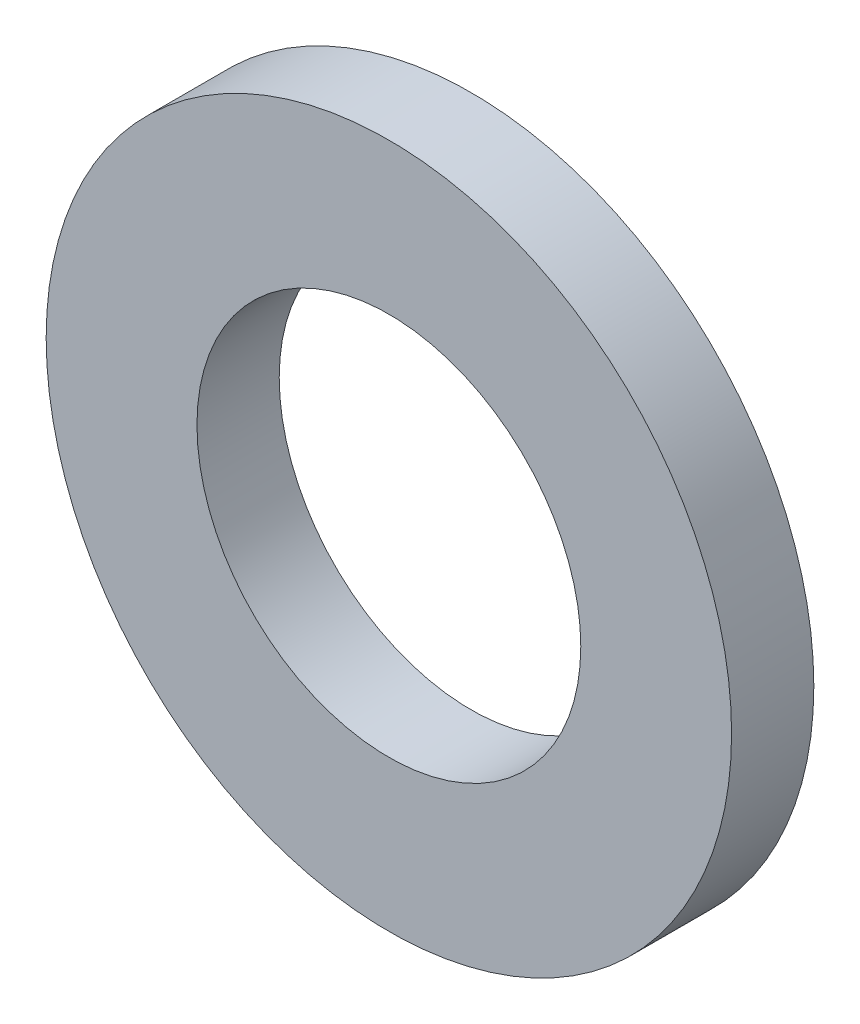
ISO-10303-21;
HEADER;
FILE_DESCRIPTION(('STEP AP214'),'2;1');
FILE_NAME('part.step','',(''),(''),'','','');
FILE_SCHEMA(('AUTOMOTIVE_DESIGN { 1 0 10303 214 1 1 1 1 }'));
ENDSEC;
DATA;
#1=APPLICATION_CONTEXT('core data for automotive mechanical design processes');
#2=APPLICATION_PROTOCOL_DEFINITION('international standard','automotive_design',2000,#1);
#3=PRODUCT_CONTEXT('',#1,'mechanical');
#4=PRODUCT('Part','Part','',(#3));
#5=PRODUCT_RELATED_PRODUCT_CATEGORY('part','',(#4));
#6=PRODUCT_DEFINITION_FORMATION('','',#4);
#7=PRODUCT_DEFINITION_CONTEXT('part definition',#1,'design');
#8=PRODUCT_DEFINITION('design','',#6,#7);
#9=PRODUCT_DEFINITION_SHAPE('','',#8);
#10=(LENGTH_UNIT() NAMED_UNIT(*) SI_UNIT(.MILLI.,.METRE.));
#11=(NAMED_UNIT(*) PLANE_ANGLE_UNIT() SI_UNIT($,.RADIAN.));
#12=(NAMED_UNIT(*) SI_UNIT($,.STERADIAN.) SOLID_ANGLE_UNIT());
#13=UNCERTAINTY_MEASURE_WITH_UNIT(LENGTH_MEASURE(1.E-05),#10,'distance_accuracy_value','');
#14=(GEOMETRIC_REPRESENTATION_CONTEXT(3) GLOBAL_UNCERTAINTY_ASSIGNED_CONTEXT((#13)) GLOBAL_UNIT_ASSIGNED_CONTEXT((#10,
#11,#12)) REPRESENTATION_CONTEXT('',''));
#15=CARTESIAN_POINT('',(0.,0.,0.));
#16=DIRECTION('',(0.,0.,1.));
#17=DIRECTION('',(1.,0.,0.));
#18=AXIS2_PLACEMENT_3D('',#15,#16,#17);
#19=CARTESIAN_POINT('',(-1.11022302462516E-13,-5.55111512312578E-13,1.7999999999998));
#20=DIRECTION('',(0.,0.,0.999999999999985));
#21=DIRECTION('',(1.00000000000007,0.,0.));
#22=AXIS2_PLACEMENT_3D('',#19,#20,#21);
#23=PLANE('',#22);
#24=CARTESIAN_POINT('',(-1.11022302462516E-13,-5.55111512312578E-13,1.7999999999998));
#25=DIRECTION('',(0.,0.,0.999999999999985));
#26=DIRECTION('',(1.00000000000007,0.,0.));
#27=AXIS2_PLACEMENT_3D('',#24,#25,#26);
#28=CIRCLE('',#27,7.5);
#29=CARTESIAN_POINT('',(-7.50000000000064,-5.46576672810772E-13,1.79999999999976));
#30=VERTEX_POINT('',#29);
#31=EDGE_CURVE('E12',#30,#30,#28,.T.);
#32=ORIENTED_EDGE('',*,*,#31,.T.);
#33=EDGE_LOOP('',(#32));
#34=FACE_BOUND('',#33,.T.);
#35=CARTESIAN_POINT('',(-1.11022302462516E-13,-5.55111512312578E-13,1.7999999999998));
#36=DIRECTION('',(0.,0.,0.999999999999985));
#37=DIRECTION('',(1.00000000000007,0.,0.));
#38=AXIS2_PLACEMENT_3D('',#35,#36,#37);
#39=CIRCLE('',#38,4.2);
#40=CARTESIAN_POINT('',(-4.20000000000041,-5.50332002191567E-13,1.79999999999978));
#41=VERTEX_POINT('',#40);
#42=EDGE_CURVE('E49',#41,#41,#39,.T.);
#43=ORIENTED_EDGE('',*,*,#42,.F.);
#44=EDGE_LOOP('',(#43));
#45=FACE_BOUND('',#44,.T.);
#46=ADVANCED_FACE('F38',(#34,#45),#23,.T.);
#47=CARTESIAN_POINT('',(0.,0.,0.));
#48=DIRECTION('',(0.,0.,0.999999999999985));
#49=DIRECTION('',(1.00000000000007,0.,0.));
#50=AXIS2_PLACEMENT_3D('',#47,#48,#49);
#51=PLANE('',#50);
#52=CARTESIAN_POINT('',(0.,0.,0.));
#53=DIRECTION('',(0.,0.,0.999999999999985));
#54=DIRECTION('',(1.00000000000007,0.,0.));
#55=AXIS2_PLACEMENT_3D('',#52,#53,#54);
#56=CIRCLE('',#55,7.5);
#57=CARTESIAN_POINT('',(-7.50000000000063,-5.35085864505903E-13,0.));
#58=VERTEX_POINT('',#57);
#59=EDGE_CURVE('E42',#58,#58,#56,.T.);
#60=ORIENTED_EDGE('',*,*,#59,.F.);
#61=EDGE_LOOP('',(#60));
#62=FACE_BOUND('',#61,.T.);
#63=CARTESIAN_POINT('',(0.,0.,0.));
#64=DIRECTION('',(0.,0.,0.999999999999985));
#65=DIRECTION('',(1.00000000000007,0.,0.));
#66=AXIS2_PLACEMENT_3D('',#63,#64,#65);
#67=CIRCLE('',#66,4.2);
#68=CARTESIAN_POINT('',(-4.2000000000004,-5.38841193886697E-13,0.));
#69=VERTEX_POINT('',#68);
#70=EDGE_CURVE('E51',#69,#69,#67,.T.);
#71=ORIENTED_EDGE('',*,*,#70,.T.);
#72=EDGE_LOOP('',(#71));
#73=FACE_BOUND('',#72,.T.);
#74=ADVANCED_FACE('F61',(#62,#73),#51,.F.);
#75=CARTESIAN_POINT('',(-1.11022302462516E-13,-5.55111512312578E-13,1.7999999999998));
#76=DIRECTION('',(0.,0.,-0.999999999999985));
#77=DIRECTION('',(-1.00000000000007,0.,0.));
#78=AXIS2_PLACEMENT_3D('',#75,#76,#77);
#79=CYLINDRICAL_SURFACE('',#78,7.5);
#80=CARTESIAN_POINT('',(-7.50000000000064,-5.46576672810772E-13,1.79999999999976));
#81=CARTESIAN_POINT('',(-7.50000000000064,-5.46456976890929E-13,1.78124999999976));
#82=CARTESIAN_POINT('',(-7.50000000000064,-5.46337280971087E-13,1.76249999999976));
#83=CARTESIAN_POINT('',(-7.50000000000064,-5.46097889131402E-13,1.72499999999977));
#84=CARTESIAN_POINT('',(-7.50000000000064,-5.4597819321156E-13,1.70624999999977));
#85=CARTESIAN_POINT('',(-7.50000000000064,-5.45738801371875E-13,1.66874999999977));
#86=CARTESIAN_POINT('',(-7.50000000000064,-5.45619105452033E-13,1.64999999999977));
#87=CARTESIAN_POINT('',(-7.50000000000064,-5.45379713612348E-13,1.61249999999978));
#88=CARTESIAN_POINT('',(-7.50000000000064,-5.45260017692505E-13,1.59374999999978));
#89=CARTESIAN_POINT('',(-7.50000000000064,-5.45020625852821E-13,1.55624999999978));
#90=CARTESIAN_POINT('',(-7.50000000000064,-5.44900929932978E-13,1.53749999999979));
#91=CARTESIAN_POINT('',(-7.50000000000064,-5.44661538093294E-13,1.49999999999979));
#92=CARTESIAN_POINT('',(-7.50000000000064,-5.44541842173451E-13,1.48124999999979));
#93=CARTESIAN_POINT('',(-7.50000000000064,-5.44302450333766E-13,1.4437499999998));
#94=CARTESIAN_POINT('',(-7.50000000000064,-5.44182754413924E-13,1.4249999999998));
#95=CARTESIAN_POINT('',(-7.50000000000064,-5.43943362574239E-13,1.3874999999998));
#96=CARTESIAN_POINT('',(-7.50000000000064,-5.43823666654397E-13,1.36874999999981));
#97=CARTESIAN_POINT('',(-7.50000000000064,-5.43584274814712E-13,1.33124999999981));
#98=CARTESIAN_POINT('',(-7.50000000000064,-5.4346457889487E-13,1.31249999999981));
#99=CARTESIAN_POINT('',(-7.50000000000064,-5.43225187055185E-13,1.27499999999982));
#100=CARTESIAN_POINT('',(-7.50000000000064,-5.43105491135343E-13,1.25624999999982));
#101=CARTESIAN_POINT('',(-7.50000000000064,-5.42866099295658E-13,1.21874999999982));
#102=CARTESIAN_POINT('',(-7.50000000000064,-5.42746403375815E-13,1.19999999999982));
#103=CARTESIAN_POINT('',(-7.50000000000064,-5.42507011536131E-13,1.16249999999983));
#104=CARTESIAN_POINT('',(-7.50000000000064,-5.42387315616288E-13,1.14374999999983));
#105=CARTESIAN_POINT('',(-7.50000000000064,-5.42147923776603E-13,1.10624999999983));
#106=CARTESIAN_POINT('',(-7.50000000000064,-5.42028227856761E-13,1.08749999999984));
#107=CARTESIAN_POINT('',(-7.50000000000064,-5.41788836017076E-13,1.04999999999984));
#108=CARTESIAN_POINT('',(-7.50000000000064,-5.41669140097234E-13,1.03124999999984));
#109=CARTESIAN_POINT('',(-7.50000000000064,-5.41429748257549E-13,0.993749999999847));
#110=CARTESIAN_POINT('',(-7.50000000000063,-5.41310052337707E-13,0.974999999999849));
#111=CARTESIAN_POINT('',(-7.50000000000063,-5.41070660498022E-13,0.937499999999853));
#112=CARTESIAN_POINT('',(-7.50000000000063,-5.4095096457818E-13,0.918749999999855));
#113=CARTESIAN_POINT('',(-7.50000000000063,-5.40711572738495E-13,0.881249999999859));
#114=CARTESIAN_POINT('',(-7.50000000000063,-5.40591876818652E-13,0.862499999999861));
#115=CARTESIAN_POINT('',(-7.50000000000063,-5.40352484978968E-13,0.824999999999865));
#116=CARTESIAN_POINT('',(-7.50000000000063,-5.40232789059125E-13,0.806249999999867));
#117=CARTESIAN_POINT('',(-7.50000000000063,-5.3999339721944E-13,0.768749999999871));
#118=CARTESIAN_POINT('',(-7.50000000000063,-5.39873701299598E-13,0.749999999999874));
#119=CARTESIAN_POINT('',(-7.50000000000063,-5.39634309459913E-13,0.712499999999878));
#120=CARTESIAN_POINT('',(-7.50000000000063,-5.39514613540071E-13,0.69374999999988));
#121=CARTESIAN_POINT('',(-7.50000000000063,-5.39275221700386E-13,0.656249999999884));
#122=CARTESIAN_POINT('',(-7.50000000000063,-5.39155525780544E-13,0.637499999999886));
#123=CARTESIAN_POINT('',(-7.50000000000063,-5.38916133940859E-13,0.59999999999989));
#124=CARTESIAN_POINT('',(-7.50000000000063,-5.38796438021017E-13,0.581249999999892));
#125=CARTESIAN_POINT('',(-7.50000000000063,-5.38557046181332E-13,0.543749999999896));
#126=CARTESIAN_POINT('',(-7.50000000000063,-5.3843735026149E-13,0.524999999999898));
#127=CARTESIAN_POINT('',(-7.50000000000063,-5.38197958421805E-13,0.487499999999903));
#128=CARTESIAN_POINT('',(-7.50000000000063,-5.38078262501962E-13,0.468749999999905));
#129=CARTESIAN_POINT('',(-7.50000000000063,-5.37838870662277E-13,0.431249999999909));
#130=CARTESIAN_POINT('',(-7.50000000000063,-5.37719174742435E-13,0.412499999999911));
#131=CARTESIAN_POINT('',(-7.50000000000063,-5.3747978290275E-13,0.374999999999915));
#132=CARTESIAN_POINT('',(-7.50000000000063,-5.37360086982908E-13,0.356249999999917));
#133=CARTESIAN_POINT('',(-7.50000000000063,-5.37120695143223E-13,0.318749999999921));
#134=CARTESIAN_POINT('',(-7.50000000000063,-5.37000999223381E-13,0.299999999999923));
#135=CARTESIAN_POINT('',(-7.50000000000063,-5.36761607383696E-13,0.262499999999927));
#136=CARTESIAN_POINT('',(-7.50000000000063,-5.36641911463854E-13,0.243749999999929));
#137=CARTESIAN_POINT('',(-7.50000000000063,-5.36402519624169E-13,0.206249999999933));
#138=CARTESIAN_POINT('',(-7.50000000000063,-5.36282823704326E-13,0.187499999999936));
#139=CARTESIAN_POINT('',(-7.50000000000063,-5.36043431864642E-13,0.14999999999994));
#140=CARTESIAN_POINT('',(-7.50000000000063,-5.35923735944799E-13,0.131249999999942));
#141=CARTESIAN_POINT('',(-7.50000000000063,-5.35684344105115E-13,0.0937499999999459));
#142=CARTESIAN_POINT('',(-7.50000000000063,-5.35564648185272E-13,0.0749999999999479));
#143=CARTESIAN_POINT('',(-7.50000000000063,-5.35325256345587E-13,0.0374999999999521));
#144=CARTESIAN_POINT('',(-7.50000000000063,-5.35205560425745E-13,0.0187499999999541));
#145=CARTESIAN_POINT('',(-7.50000000000063,-5.35085864505903E-13,0.));
#146=B_SPLINE_CURVE_WITH_KNOTS('',3,(#80,#81,#82,#83,#84,#85,#86,#87,#88,#89,#90,#91,#92,#93,
#94,#95,#96,#97,#98,#99,#100,#101,#102,#103,#104,#105,#106,#107,#108,#109,#110,#111,#112,#113,
#114,#115,#116,#117,#118,#119,#120,#121,#122,#123,#124,#125,#126,#127,#128,#129,#130,#131,#132,
#133,#134,#135,#136,#137,#138,#139,#140,#141,#142,#143,#144,#145),.UNSPECIFIED.,.F.,.F.,(4,2,2,
2,2,2,2,2,2,2,2,2,2,2,2,2,2,2,2,2,2,2,2,2,2,2,2,2,2,2,2,2,4),(0.,0.056249999999994,
0.112499999999988,0.168749999999982,0.224999999999975,0.281249999999969,0.337499999999963,
0.393749999999957,0.449999999999951,0.506249999999944,0.562499999999938,0.618749999999932,
0.674999999999926,0.73124999999992,0.787499999999913,0.843749999999907,0.899999999999901,
0.956249999999895,1.01249999999989,1.06874999999988,1.12499999999988,1.18124999999987,
1.23749999999986,1.29374999999986,1.34999999999985,1.40624999999985,1.46249999999984,
1.51874999999983,1.57499999999983,1.63124999999982,1.68749999999981,1.74374999999981,
1.7999999999998),.UNSPECIFIED.);
#147=EDGE_CURVE('BSEAM40',#30,#58,#146,.T.);
#148=ORIENTED_EDGE('',*,*,#31,.F.);
#149=ORIENTED_EDGE('',*,*,#59,.T.);
#150=ORIENTED_EDGE('',*,*,#147,.T.);
#151=ORIENTED_EDGE('',*,*,#147,.F.);
#152=EDGE_LOOP('',(#148,#150,#149,#151));
#153=FACE_BOUND('',#152,.T.);
#154=ADVANCED_FACE('F40',(#153),#79,.T.);
#155=CARTESIAN_POINT('',(-1.11022302462516E-13,-5.55111512312578E-13,1.7999999999998));
#156=DIRECTION('',(0.,0.,-0.999999999999985));
#157=DIRECTION('',(-1.00000000000007,0.,0.));
#158=AXIS2_PLACEMENT_3D('',#155,#156,#157);
#159=CYLINDRICAL_SURFACE('',#158,4.2);
#160=CARTESIAN_POINT('',(-4.20000000000041,-5.50332002191567E-13,1.79999999999978));
#161=CARTESIAN_POINT('',(-4.20000000000041,-5.50212306271724E-13,1.78124999999978));
#162=CARTESIAN_POINT('',(-4.20000000000041,-5.50092610351882E-13,1.76249999999978));
#163=CARTESIAN_POINT('',(-4.20000000000041,-5.49853218512197E-13,1.72499999999979));
#164=CARTESIAN_POINT('',(-4.20000000000041,-5.49733522592355E-13,1.70624999999979));
#165=CARTESIAN_POINT('',(-4.20000000000041,-5.4949413075267E-13,1.66874999999979));
#166=CARTESIAN_POINT('',(-4.20000000000041,-5.49374434832828E-13,1.64999999999979));
#167=CARTESIAN_POINT('',(-4.20000000000041,-5.49135042993143E-13,1.6124999999998));
#168=CARTESIAN_POINT('',(-4.20000000000041,-5.490153470733E-13,1.5937499999998));
#169=CARTESIAN_POINT('',(-4.20000000000041,-5.48775955233616E-13,1.5562499999998));
#170=CARTESIAN_POINT('',(-4.20000000000041,-5.48656259313773E-13,1.53749999999981));
#171=CARTESIAN_POINT('',(-4.20000000000041,-5.48416867474088E-13,1.49999999999981));
#172=CARTESIAN_POINT('',(-4.20000000000041,-5.48297171554246E-13,1.48124999999981));
#173=CARTESIAN_POINT('',(-4.20000000000041,-5.48057779714561E-13,1.44374999999982));
#174=CARTESIAN_POINT('',(-4.20000000000041,-5.47938083794719E-13,1.42499999999982));
#175=CARTESIAN_POINT('',(-4.20000000000041,-5.47698691955034E-13,1.38749999999982));
#176=CARTESIAN_POINT('',(-4.20000000000041,-5.47578996035192E-13,1.36874999999982));
#177=CARTESIAN_POINT('',(-4.20000000000041,-5.47339604195507E-13,1.33124999999983));
#178=CARTESIAN_POINT('',(-4.20000000000041,-5.47219908275665E-13,1.31249999999983));
#179=CARTESIAN_POINT('',(-4.20000000000041,-5.4698051643598E-13,1.27499999999984));
#180=CARTESIAN_POINT('',(-4.2000000000004,-5.46860820516137E-13,1.25624999999984));
#181=CARTESIAN_POINT('',(-4.2000000000004,-5.46621428676453E-13,1.21874999999984));
#182=CARTESIAN_POINT('',(-4.2000000000004,-5.4650173275661E-13,1.19999999999984));
#183=CARTESIAN_POINT('',(-4.2000000000004,-5.46262340916925E-13,1.16249999999985));
#184=CARTESIAN_POINT('',(-4.2000000000004,-5.46142644997083E-13,1.14374999999985));
#185=CARTESIAN_POINT('',(-4.2000000000004,-5.45903253157398E-13,1.10624999999985));
#186=CARTESIAN_POINT('',(-4.2000000000004,-5.45783557237556E-13,1.08749999999986));
#187=CARTESIAN_POINT('',(-4.2000000000004,-5.45544165397871E-13,1.04999999999986));
#188=CARTESIAN_POINT('',(-4.2000000000004,-5.45424469478029E-13,1.03124999999986));
#189=CARTESIAN_POINT('',(-4.2000000000004,-5.45185077638344E-13,0.993749999999866));
#190=CARTESIAN_POINT('',(-4.2000000000004,-5.45065381718501E-13,0.974999999999868));
#191=CARTESIAN_POINT('',(-4.2000000000004,-5.44825989878817E-13,0.937499999999872));
#192=CARTESIAN_POINT('',(-4.2000000000004,-5.44706293958974E-13,0.918749999999875));
#193=CARTESIAN_POINT('',(-4.2000000000004,-5.4446690211929E-13,0.881249999999879));
#194=CARTESIAN_POINT('',(-4.2000000000004,-5.44347206199447E-13,0.862499999999881));
#195=CARTESIAN_POINT('',(-4.2000000000004,-5.44107814359762E-13,0.824999999999885));
#196=CARTESIAN_POINT('',(-4.2000000000004,-5.4398811843992E-13,0.806249999999887));
#197=CARTESIAN_POINT('',(-4.2000000000004,-5.43748726600235E-13,0.768749999999891));
#198=CARTESIAN_POINT('',(-4.2000000000004,-5.43629030680393E-13,0.749999999999893));
#199=CARTESIAN_POINT('',(-4.2000000000004,-5.43389638840708E-13,0.712499999999897));
#200=CARTESIAN_POINT('',(-4.2000000000004,-5.43269942920866E-13,0.693749999999899));
#201=CARTESIAN_POINT('',(-4.2000000000004,-5.43030551081181E-13,0.656249999999903));
#202=CARTESIAN_POINT('',(-4.2000000000004,-5.42910855161339E-13,0.637499999999905));
#203=CARTESIAN_POINT('',(-4.2000000000004,-5.42671463321654E-13,0.59999999999991));
#204=CARTESIAN_POINT('',(-4.2000000000004,-5.42551767401811E-13,0.581249999999912));
#205=CARTESIAN_POINT('',(-4.2000000000004,-5.42312375562127E-13,0.543749999999916));
#206=CARTESIAN_POINT('',(-4.2000000000004,-5.42192679642284E-13,0.524999999999918));
#207=CARTESIAN_POINT('',(-4.2000000000004,-5.41953287802599E-13,0.487499999999922));
#208=CARTESIAN_POINT('',(-4.2000000000004,-5.41833591882757E-13,0.468749999999924));
#209=CARTESIAN_POINT('',(-4.2000000000004,-5.41594200043072E-13,0.431249999999928));
#210=CARTESIAN_POINT('',(-4.2000000000004,-5.4147450412323E-13,0.41249999999993));
#211=CARTESIAN_POINT('',(-4.2000000000004,-5.41235112283545E-13,0.374999999999934));
#212=CARTESIAN_POINT('',(-4.2000000000004,-5.41115416363703E-13,0.356249999999936));
#213=CARTESIAN_POINT('',(-4.2000000000004,-5.40876024524018E-13,0.318749999999941));
#214=CARTESIAN_POINT('',(-4.2000000000004,-5.40756328604176E-13,0.299999999999943));
#215=CARTESIAN_POINT('',(-4.2000000000004,-5.40516936764491E-13,0.262499999999947));
#216=CARTESIAN_POINT('',(-4.2000000000004,-5.40397240844648E-13,0.243749999999949));
#217=CARTESIAN_POINT('',(-4.2000000000004,-5.40157849004964E-13,0.206249999999953));
#218=CARTESIAN_POINT('',(-4.2000000000004,-5.40038153085121E-13,0.187499999999955));
#219=CARTESIAN_POINT('',(-4.2000000000004,-5.39798761245437E-13,0.149999999999959));
#220=CARTESIAN_POINT('',(-4.2000000000004,-5.39679065325594E-13,0.131249999999961));
#221=CARTESIAN_POINT('',(-4.2000000000004,-5.39439673485909E-13,0.0937499999999654));
#222=CARTESIAN_POINT('',(-4.2000000000004,-5.39319977566067E-13,0.0749999999999675));
#223=CARTESIAN_POINT('',(-4.2000000000004,-5.39080585726382E-13,0.0374999999999716));
#224=CARTESIAN_POINT('',(-4.2000000000004,-5.3896088980654E-13,0.0187499999999736));
#225=CARTESIAN_POINT('',(-4.2000000000004,-5.38841193886697E-13,0.));
#226=B_SPLINE_CURVE_WITH_KNOTS('',3,(#160,#161,#162,#163,#164,#165,#166,#167,#168,#169,#170,
#171,#172,#173,#174,#175,#176,#177,#178,#179,#180,#181,#182,#183,#184,#185,#186,#187,#188,#189,
#190,#191,#192,#193,#194,#195,#196,#197,#198,#199,#200,#201,#202,#203,#204,#205,#206,#207,#208,
#209,#210,#211,#212,#213,#214,#215,#216,#217,#218,#219,#220,#221,#222,#223,#224,#225),
.UNSPECIFIED.,.F.,.F.,(4,2,2,2,2,2,2,2,2,2,2,2,2,2,2,2,2,2,2,2,2,2,2,2,2,2,2,2,2,2,2,2,4),(0.,
0.0562499999999936,0.112499999999987,0.168749999999981,0.224999999999975,0.281249999999969,
0.337499999999963,0.393749999999956,0.44999999999995,0.506249999999944,0.562499999999938,
0.618749999999932,0.674999999999925,0.731249999999919,0.787499999999913,0.843749999999907,
0.899999999999901,0.956249999999894,1.01249999999989,1.06874999999988,1.12499999999988,
1.18124999999987,1.23749999999986,1.29374999999986,1.34999999999985,1.40624999999985,
1.46249999999984,1.51874999999983,1.57499999999983,1.63124999999982,1.68749999999981,
1.74374999999981,1.7999999999998),.UNSPECIFIED.);
#227=EDGE_CURVE('BSEAM57',#41,#69,#226,.T.);
#228=ORIENTED_EDGE('',*,*,#42,.T.);
#229=ORIENTED_EDGE('',*,*,#70,.F.);
#230=ORIENTED_EDGE('',*,*,#227,.T.);
#231=ORIENTED_EDGE('',*,*,#227,.F.);
#232=EDGE_LOOP('',(#228,#230,#229,#231));
#233=FACE_BOUND('',#232,.T.);
#234=ADVANCED_FACE('F57',(#233),#159,.F.);
#235=CLOSED_SHELL('',(#46,#74,#154,#234));
#236=MANIFOLD_SOLID_BREP('B2',#235);
#237=ADVANCED_BREP_SHAPE_REPRESENTATION('',(#18,#236),#14);
#238=SHAPE_DEFINITION_REPRESENTATION(#9,#237);
ENDSEC;
END-ISO-10303-21;
